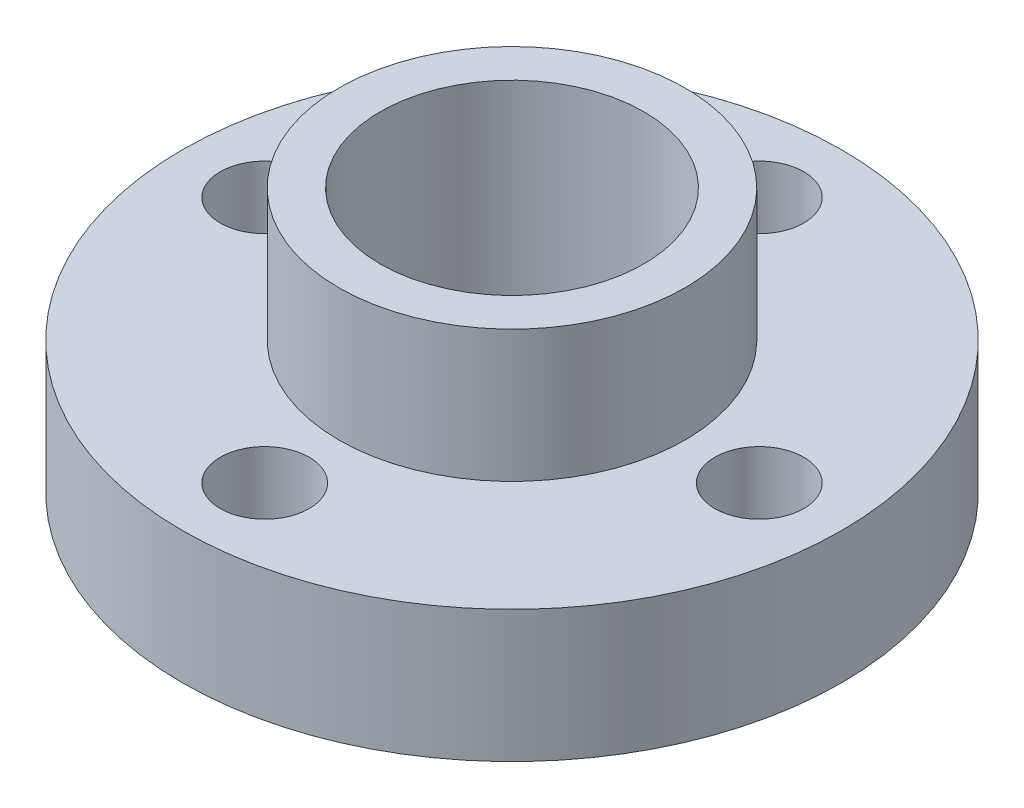
ISO-10303-21;
HEADER;
FILE_DESCRIPTION(('STEP AP214'),'2;1');
FILE_NAME('part.step','',(''),(''),'','','');
FILE_SCHEMA(('AUTOMOTIVE_DESIGN { 1 0 10303 214 1 1 1 1 }'));
ENDSEC;
DATA;
#1=APPLICATION_CONTEXT('core data for automotive mechanical design processes');
#2=APPLICATION_PROTOCOL_DEFINITION('international standard','automotive_design',2000,#1);
#3=PRODUCT_CONTEXT('',#1,'mechanical');
#4=PRODUCT('Part','Part','',(#3));
#5=PRODUCT_RELATED_PRODUCT_CATEGORY('part','',(#4));
#6=PRODUCT_DEFINITION_FORMATION('','',#4);
#7=PRODUCT_DEFINITION_CONTEXT('part definition',#1,'design');
#8=PRODUCT_DEFINITION('design','',#6,#7);
#9=PRODUCT_DEFINITION_SHAPE('','',#8);
#10=(LENGTH_UNIT() NAMED_UNIT(*) SI_UNIT(.MILLI.,.METRE.));
#11=(NAMED_UNIT(*) PLANE_ANGLE_UNIT() SI_UNIT($,.RADIAN.));
#12=(NAMED_UNIT(*) SI_UNIT($,.STERADIAN.) SOLID_ANGLE_UNIT());
#13=UNCERTAINTY_MEASURE_WITH_UNIT(LENGTH_MEASURE(1.E-05),#10,'distance_accuracy_value','');
#14=(GEOMETRIC_REPRESENTATION_CONTEXT(3) GLOBAL_UNCERTAINTY_ASSIGNED_CONTEXT((#13)) GLOBAL_UNIT_ASSIGNED_CONTEXT((#10,
#11,#12)) REPRESENTATION_CONTEXT('',''));
#15=CARTESIAN_POINT('',(0.,0.,0.));
#16=DIRECTION('',(0.,0.,1.));
#17=DIRECTION('',(1.,0.,0.));
#18=AXIS2_PLACEMENT_3D('',#15,#16,#17);
#19=CARTESIAN_POINT('',(0.,4.,0.));
#20=DIRECTION('',(0.,1.,0.));
#21=DIRECTION('',(0.,0.,1.));
#22=AXIS2_PLACEMENT_3D('',#19,#20,#21);
#23=PLANE('',#22);
#24=CARTESIAN_POINT('',(-7.5,4.,0.));
#25=DIRECTION('',(0.,1.,0.));
#26=DIRECTION('',(0.,0.,-1.));
#27=AXIS2_PLACEMENT_3D('',#24,#25,#26);
#28=CIRCLE('',#27,1.35);
#29=CARTESIAN_POINT('',(-7.5,4.,-1.35));
#30=VERTEX_POINT('',#29);
#31=EDGE_CURVE('E68',#30,#30,#28,.T.);
#32=ORIENTED_EDGE('',*,*,#31,.F.);
#33=EDGE_LOOP('',(#32));
#34=FACE_BOUND('',#33,.T.);
#35=CARTESIAN_POINT('',(0.,4.,7.5));
#36=DIRECTION('',(0.,1.,0.));
#37=DIRECTION('',(0.,0.,-1.));
#38=AXIS2_PLACEMENT_3D('',#35,#36,#37);
#39=CIRCLE('',#38,1.35);
#40=CARTESIAN_POINT('',(0.,4.,6.15));
#41=VERTEX_POINT('',#40);
#42=EDGE_CURVE('E62',#41,#41,#39,.T.);
#43=ORIENTED_EDGE('',*,*,#42,.F.);
#44=EDGE_LOOP('',(#43));
#45=FACE_BOUND('',#44,.T.);
#46=CARTESIAN_POINT('',(7.5,4.,0.));
#47=DIRECTION('',(0.,1.,0.));
#48=DIRECTION('',(0.,0.,1.));
#49=AXIS2_PLACEMENT_3D('',#46,#47,#48);
#50=CIRCLE('',#49,1.35);
#51=CARTESIAN_POINT('',(7.5,4.,1.35));
#52=VERTEX_POINT('',#51);
#53=EDGE_CURVE('E56',#52,#52,#50,.T.);
#54=ORIENTED_EDGE('',*,*,#53,.F.);
#55=EDGE_LOOP('',(#54));
#56=FACE_BOUND('',#55,.T.);
#57=CARTESIAN_POINT('',(0.,4.,-7.5));
#58=DIRECTION('',(0.,1.,0.));
#59=DIRECTION('',(0.,0.,1.));
#60=AXIS2_PLACEMENT_3D('',#57,#58,#59);
#61=CIRCLE('',#60,1.35);
#62=CARTESIAN_POINT('',(0.,4.,-6.15));
#63=VERTEX_POINT('',#62);
#64=EDGE_CURVE('E50',#63,#63,#61,.T.);
#65=ORIENTED_EDGE('',*,*,#64,.F.);
#66=EDGE_LOOP('',(#65));
#67=FACE_BOUND('',#66,.T.);
#68=CARTESIAN_POINT('',(0.,4.,0.));
#69=DIRECTION('',(0.,1.,0.));
#70=DIRECTION('',(0.,0.,1.));
#71=AXIS2_PLACEMENT_3D('',#68,#69,#70);
#72=CIRCLE('',#71,10.);
#73=CARTESIAN_POINT('',(0.,4.,10.));
#74=VERTEX_POINT('',#73);
#75=EDGE_CURVE('E10',#74,#74,#72,.T.);
#76=ORIENTED_EDGE('',*,*,#75,.T.);
#77=EDGE_LOOP('',(#76));
#78=FACE_BOUND('',#77,.T.);
#79=CARTESIAN_POINT('',(0.,4.,0.));
#80=DIRECTION('',(0.,1.,0.));
#81=DIRECTION('',(0.,0.,1.));
#82=AXIS2_PLACEMENT_3D('',#79,#80,#81);
#83=CIRCLE('',#82,5.25);
#84=CARTESIAN_POINT('',(0.,4.,5.25));
#85=VERTEX_POINT('',#84);
#86=EDGE_CURVE('E44',#85,#85,#83,.T.);
#87=ORIENTED_EDGE('',*,*,#86,.F.);
#88=EDGE_LOOP('',(#87));
#89=FACE_BOUND('',#88,.T.);
#90=ADVANCED_FACE('F31',(#34,#45,#56,#67,#78,#89),#23,.T.);
#91=CARTESIAN_POINT('',(0.,4.,0.));
#92=DIRECTION('',(0.,-1.,0.));
#93=DIRECTION('',(0.,0.,-1.));
#94=AXIS2_PLACEMENT_3D('',#91,#92,#93);
#95=CYLINDRICAL_SURFACE('',#94,10.);
#96=ORIENTED_EDGE('',*,*,#75,.F.);
#97=EDGE_LOOP('',(#96));
#98=FACE_BOUND('',#97,.T.);
#99=CARTESIAN_POINT('',(0.,0.,0.));
#100=DIRECTION('',(0.,1.,0.));
#101=DIRECTION('',(0.,0.,1.));
#102=AXIS2_PLACEMENT_3D('',#99,#100,#101);
#103=CIRCLE('',#102,10.);
#104=CARTESIAN_POINT('',(0.,0.,10.));
#105=VERTEX_POINT('',#104);
#106=EDGE_CURVE('E35',#105,#105,#103,.T.);
#107=ORIENTED_EDGE('',*,*,#106,.T.);
#108=EDGE_LOOP('',(#107));
#109=FACE_BOUND('',#108,.T.);
#110=ADVANCED_FACE('F33',(#98,#109),#95,.T.);
#111=CARTESIAN_POINT('',(0.,0.,0.));
#112=DIRECTION('',(0.,1.,0.));
#113=DIRECTION('',(0.,0.,1.));
#114=AXIS2_PLACEMENT_3D('',#111,#112,#113);
#115=PLANE('',#114);
#116=CARTESIAN_POINT('',(0.,0.,0.));
#117=DIRECTION('',(0.,1.,0.));
#118=DIRECTION('',(0.,0.,1.));
#119=AXIS2_PLACEMENT_3D('',#116,#117,#118);
#120=CIRCLE('',#119,4.);
#121=CARTESIAN_POINT('',(0.,0.,4.));
#122=VERTEX_POINT('',#121);
#123=EDGE_CURVE('E71',#122,#122,#120,.T.);
#124=ORIENTED_EDGE('',*,*,#123,.T.);
#125=EDGE_LOOP('',(#124));
#126=FACE_BOUND('',#125,.T.);
#127=CARTESIAN_POINT('',(-7.5,0.,0.));
#128=DIRECTION('',(0.,1.,0.));
#129=DIRECTION('',(0.,0.,-1.));
#130=AXIS2_PLACEMENT_3D('',#127,#128,#129);
#131=CIRCLE('',#130,1.35);
#132=CARTESIAN_POINT('',(-7.5,0.,-1.35));
#133=VERTEX_POINT('',#132);
#134=EDGE_CURVE('E65',#133,#133,#131,.T.);
#135=ORIENTED_EDGE('',*,*,#134,.T.);
#136=EDGE_LOOP('',(#135));
#137=FACE_BOUND('',#136,.T.);
#138=CARTESIAN_POINT('',(0.,0.,7.5));
#139=DIRECTION('',(0.,1.,0.));
#140=DIRECTION('',(0.,0.,-1.));
#141=AXIS2_PLACEMENT_3D('',#138,#139,#140);
#142=CIRCLE('',#141,1.35);
#143=CARTESIAN_POINT('',(0.,0.,6.15));
#144=VERTEX_POINT('',#143);
#145=EDGE_CURVE('E59',#144,#144,#142,.T.);
#146=ORIENTED_EDGE('',*,*,#145,.T.);
#147=EDGE_LOOP('',(#146));
#148=FACE_BOUND('',#147,.T.);
#149=CARTESIAN_POINT('',(7.5,0.,0.));
#150=DIRECTION('',(0.,1.,0.));
#151=DIRECTION('',(0.,0.,1.));
#152=AXIS2_PLACEMENT_3D('',#149,#150,#151);
#153=CIRCLE('',#152,1.35);
#154=CARTESIAN_POINT('',(7.5,0.,1.35));
#155=VERTEX_POINT('',#154);
#156=EDGE_CURVE('E53',#155,#155,#153,.T.);
#157=ORIENTED_EDGE('',*,*,#156,.T.);
#158=EDGE_LOOP('',(#157));
#159=FACE_BOUND('',#158,.T.);
#160=CARTESIAN_POINT('',(0.,0.,-7.5));
#161=DIRECTION('',(0.,1.,0.));
#162=DIRECTION('',(0.,0.,1.));
#163=AXIS2_PLACEMENT_3D('',#160,#161,#162);
#164=CIRCLE('',#163,1.35);
#165=CARTESIAN_POINT('',(0.,0.,-6.15));
#166=VERTEX_POINT('',#165);
#167=EDGE_CURVE('E47',#166,#166,#164,.T.);
#168=ORIENTED_EDGE('',*,*,#167,.T.);
#169=EDGE_LOOP('',(#168));
#170=FACE_BOUND('',#169,.T.);
#171=ORIENTED_EDGE('',*,*,#106,.F.);
#172=EDGE_LOOP('',(#171));
#173=FACE_BOUND('',#172,.T.);
#174=ADVANCED_FACE('F80',(#126,#137,#148,#159,#170,#173),#115,.F.);
#175=CARTESIAN_POINT('',(0.,8.,0.));
#176=DIRECTION('',(0.,-1.,0.));
#177=DIRECTION('',(0.,0.,-1.));
#178=AXIS2_PLACEMENT_3D('',#175,#176,#177);
#179=CYLINDRICAL_SURFACE('',#178,5.25);
#180=CARTESIAN_POINT('',(0.,8.,0.));
#181=DIRECTION('',(0.,1.,0.));
#182=DIRECTION('',(0.,0.,1.));
#183=AXIS2_PLACEMENT_3D('',#180,#181,#182);
#184=CIRCLE('',#183,5.25);
#185=CARTESIAN_POINT('',(0.,8.,5.25));
#186=VERTEX_POINT('',#185);
#187=EDGE_CURVE('E42',#186,#186,#184,.T.);
#188=ORIENTED_EDGE('',*,*,#187,.F.);
#189=EDGE_LOOP('',(#188));
#190=FACE_BOUND('',#189,.T.);
#191=ORIENTED_EDGE('',*,*,#86,.T.);
#192=EDGE_LOOP('',(#191));
#193=FACE_BOUND('',#192,.T.);
#194=ADVANCED_FACE('F94',(#190,#193),#179,.T.);
#195=CARTESIAN_POINT('',(0.,8.,0.));
#196=DIRECTION('',(0.,1.,0.));
#197=DIRECTION('',(0.,0.,1.));
#198=AXIS2_PLACEMENT_3D('',#195,#196,#197);
#199=PLANE('',#198);
#200=CARTESIAN_POINT('',(0.,8.,0.));
#201=DIRECTION('',(0.,1.,0.));
#202=DIRECTION('',(0.,0.,1.));
#203=AXIS2_PLACEMENT_3D('',#200,#201,#202);
#204=CIRCLE('',#203,4.);
#205=CARTESIAN_POINT('',(0.,8.,4.));
#206=VERTEX_POINT('',#205);
#207=EDGE_CURVE('E74',#206,#206,#204,.T.);
#208=ORIENTED_EDGE('',*,*,#207,.F.);
#209=EDGE_LOOP('',(#208));
#210=FACE_BOUND('',#209,.T.);
#211=ORIENTED_EDGE('',*,*,#187,.T.);
#212=EDGE_LOOP('',(#211));
#213=FACE_BOUND('',#212,.T.);
#214=ADVANCED_FACE('F90',(#210,#213),#199,.T.);
#215=CARTESIAN_POINT('',(0.,0.,-7.5));
#216=DIRECTION('',(0.,1.,0.));
#217=DIRECTION('',(0.,0.,1.));
#218=AXIS2_PLACEMENT_3D('',#215,#216,#217);
#219=CYLINDRICAL_SURFACE('',#218,1.35);
#220=ORIENTED_EDGE('',*,*,#167,.F.);
#221=EDGE_LOOP('',(#220));
#222=FACE_BOUND('',#221,.T.);
#223=ORIENTED_EDGE('',*,*,#64,.T.);
#224=EDGE_LOOP('',(#223));
#225=FACE_BOUND('',#224,.T.);
#226=ADVANCED_FACE('F93',(#222,#225),#219,.F.);
#227=CARTESIAN_POINT('',(7.5,0.,0.));
#228=DIRECTION('',(0.,1.,0.));
#229=DIRECTION('',(0.,0.,1.));
#230=AXIS2_PLACEMENT_3D('',#227,#228,#229);
#231=CYLINDRICAL_SURFACE('',#230,1.35);
#232=ORIENTED_EDGE('',*,*,#156,.F.);
#233=EDGE_LOOP('',(#232));
#234=FACE_BOUND('',#233,.T.);
#235=ORIENTED_EDGE('',*,*,#53,.T.);
#236=EDGE_LOOP('',(#235));
#237=FACE_BOUND('',#236,.T.);
#238=ADVANCED_FACE('F133',(#234,#237),#231,.F.);
#239=CARTESIAN_POINT('',(0.,0.,7.5));
#240=DIRECTION('',(0.,1.,0.));
#241=DIRECTION('',(0.,0.,1.));
#242=AXIS2_PLACEMENT_3D('',#239,#240,#241);
#243=CYLINDRICAL_SURFACE('',#242,1.35);
#244=ORIENTED_EDGE('',*,*,#145,.F.);
#245=EDGE_LOOP('',(#244));
#246=FACE_BOUND('',#245,.T.);
#247=ORIENTED_EDGE('',*,*,#42,.T.);
#248=EDGE_LOOP('',(#247));
#249=FACE_BOUND('',#248,.T.);
#250=ADVANCED_FACE('F141',(#246,#249),#243,.F.);
#251=CARTESIAN_POINT('',(-7.5,0.,0.));
#252=DIRECTION('',(0.,1.,0.));
#253=DIRECTION('',(0.,0.,1.));
#254=AXIS2_PLACEMENT_3D('',#251,#252,#253);
#255=CYLINDRICAL_SURFACE('',#254,1.35);
#256=ORIENTED_EDGE('',*,*,#134,.F.);
#257=EDGE_LOOP('',(#256));
#258=FACE_BOUND('',#257,.T.);
#259=ORIENTED_EDGE('',*,*,#31,.T.);
#260=EDGE_LOOP('',(#259));
#261=FACE_BOUND('',#260,.T.);
#262=ADVANCED_FACE('F86',(#258,#261),#255,.F.);
#263=CARTESIAN_POINT('',(0.,0.,0.));
#264=DIRECTION('',(0.,1.,0.));
#265=DIRECTION('',(0.,0.,1.));
#266=AXIS2_PLACEMENT_3D('',#263,#264,#265);
#267=CYLINDRICAL_SURFACE('',#266,4.);
#268=ORIENTED_EDGE('',*,*,#123,.F.);
#269=EDGE_LOOP('',(#268));
#270=FACE_BOUND('',#269,.T.);
#271=ORIENTED_EDGE('',*,*,#207,.T.);
#272=EDGE_LOOP('',(#271));
#273=FACE_BOUND('',#272,.T.);
#274=ADVANCED_FACE('F83',(#270,#273),#267,.F.);
#275=CLOSED_SHELL('',(#90,#110,#174,#194,#214,#226,#238,#250,#262,#274));
#276=MANIFOLD_SOLID_BREP('B2',#275);
#277=ADVANCED_BREP_SHAPE_REPRESENTATION('',(#18,#276),#14);
#278=SHAPE_DEFINITION_REPRESENTATION(#9,#277);
ENDSEC;
END-ISO-10303-21;
